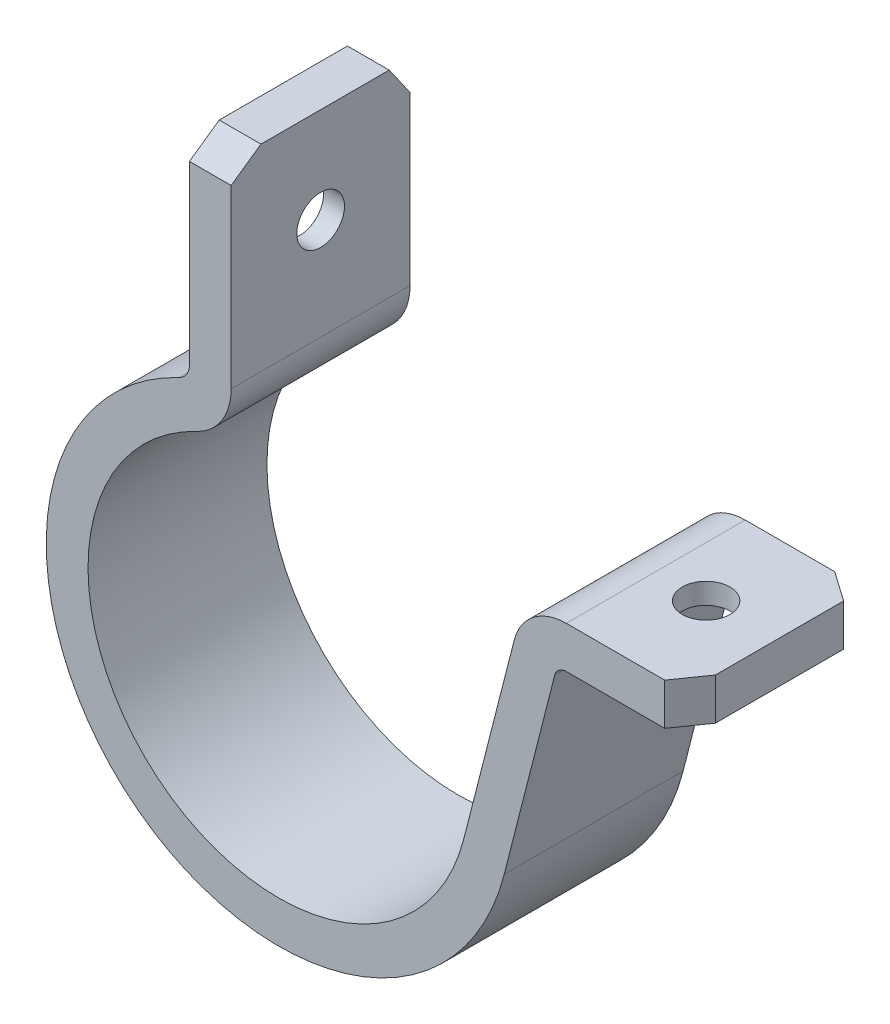
ISO-10303-21;
HEADER;
FILE_DESCRIPTION(('STEP AP214'),'2;1');
FILE_NAME('part.step','',(''),(''),'','','');
FILE_SCHEMA(('AUTOMOTIVE_DESIGN { 1 0 10303 214 1 1 1 1 }'));
ENDSEC;
DATA;
#1=APPLICATION_CONTEXT('core data for automotive mechanical design processes');
#2=APPLICATION_PROTOCOL_DEFINITION('international standard','automotive_design',2000,#1);
#3=PRODUCT_CONTEXT('',#1,'mechanical');
#4=PRODUCT('Part','Part','',(#3));
#5=PRODUCT_RELATED_PRODUCT_CATEGORY('part','',(#4));
#6=PRODUCT_DEFINITION_FORMATION('','',#4);
#7=PRODUCT_DEFINITION_CONTEXT('part definition',#1,'design');
#8=PRODUCT_DEFINITION('design','',#6,#7);
#9=PRODUCT_DEFINITION_SHAPE('','',#8);
#10=(LENGTH_UNIT() NAMED_UNIT(*) SI_UNIT(.MILLI.,.METRE.));
#11=(NAMED_UNIT(*) PLANE_ANGLE_UNIT() SI_UNIT($,.RADIAN.));
#12=(NAMED_UNIT(*) SI_UNIT($,.STERADIAN.) SOLID_ANGLE_UNIT());
#13=UNCERTAINTY_MEASURE_WITH_UNIT(LENGTH_MEASURE(1.E-05),#10,'distance_accuracy_value','');
#14=(GEOMETRIC_REPRESENTATION_CONTEXT(3) GLOBAL_UNCERTAINTY_ASSIGNED_CONTEXT((#13)) GLOBAL_UNIT_ASSIGNED_CONTEXT((#10,
#11,#12)) REPRESENTATION_CONTEXT('',''));
#15=CARTESIAN_POINT('',(0.,0.,0.));
#16=DIRECTION('',(0.,0.,1.));
#17=DIRECTION('',(1.,0.,0.));
#18=AXIS2_PLACEMENT_3D('',#15,#16,#17);
#19=CARTESIAN_POINT('',(38.1,-3.5,15.));
#20=DIRECTION('',(-1.,0.,0.));
#21=DIRECTION('',(0.,0.,1.));
#22=AXIS2_PLACEMENT_3D('',#19,#20,#21);
#23=PLANE('',#22);
#24=DIRECTION('',(0.,0.,-1.));
#25=VECTOR('',#24,1.);
#26=CARTESIAN_POINT('',(38.1,-3.5,15.));
#27=LINE('',#26,#25);
#28=CARTESIAN_POINT('',(38.1,-3.5,12.5));
#29=VERTEX_POINT('',#28);
#30=CARTESIAN_POINT('',(38.1,-3.5,1.75051884552427));
#31=VERTEX_POINT('',#30);
#32=EDGE_CURVE('E212',#29,#31,#27,.T.);
#33=ORIENTED_EDGE('',*,*,#32,.T.);
#34=DIRECTION('',(0.,1.,0.));
#35=VECTOR('',#34,1.);
#36=CARTESIAN_POINT('',(38.1,-3.5,1.75051884552427));
#37=LINE('',#36,#35);
#38=CARTESIAN_POINT('',(38.1,0.,1.75051884552427));
#39=VERTEX_POINT('',#38);
#40=EDGE_CURVE('E258',#31,#39,#37,.T.);
#41=ORIENTED_EDGE('',*,*,#40,.T.);
#42=DIRECTION('',(0.,0.,-1.));
#43=VECTOR('',#42,1.);
#44=CARTESIAN_POINT('',(38.1,0.,15.));
#45=LINE('',#44,#43);
#46=CARTESIAN_POINT('',(38.1,0.,12.5));
#47=VERTEX_POINT('',#46);
#48=EDGE_CURVE('E191',#47,#39,#45,.T.);
#49=ORIENTED_EDGE('',*,*,#48,.F.);
#50=DIRECTION('',(0.,-1.,0.));
#51=VECTOR('',#50,1.);
#52=CARTESIAN_POINT('',(38.1,-3.5,12.5));
#53=LINE('',#52,#51);
#54=EDGE_CURVE('E256',#47,#29,#53,.T.);
#55=ORIENTED_EDGE('',*,*,#54,.T.);
#56=EDGE_LOOP('',(#33,#41,#49,#55));
#57=FACE_BOUND('',#56,.T.);
#58=ADVANCED_FACE('F35',(#57),#23,.F.);
#59=CARTESIAN_POINT('',(24.6,0.,15.));
#60=DIRECTION('',(0.,-1.,0.));
#61=DIRECTION('',(0.,0.,-1.));
#62=AXIS2_PLACEMENT_3D('',#59,#60,#61);
#63=PLANE('',#62);
#64=CARTESIAN_POINT('',(32.3184466019417,0.,7.5));
#65=DIRECTION('',(0.,-1.,0.));
#66=DIRECTION('',(0.,0.,-1.));
#67=AXIS2_PLACEMENT_3D('',#64,#65,#66);
#68=CIRCLE('',#67,2.);
#69=CARTESIAN_POINT('',(32.3184466019417,0.,5.5));
#70=VERTEX_POINT('',#69);
#71=EDGE_CURVE('E215',#70,#70,#68,.T.);
#72=ORIENTED_EDGE('',*,*,#71,.T.);
#73=EDGE_LOOP('',(#72));
#74=FACE_BOUND('',#73,.T.);
#75=DIRECTION('',(-1.,0.,0.));
#76=VECTOR('',#75,1.);
#77=CARTESIAN_POINT('',(24.6,0.,0.));
#78=LINE('',#77,#76);
#79=CARTESIAN_POINT('',(35.6,0.,0.));
#80=VERTEX_POINT('',#79);
#81=CARTESIAN_POINT('',(28.095145631068,0.,0.));
#82=VERTEX_POINT('',#81);
#83=EDGE_CURVE('E213',#80,#82,#78,.T.);
#84=ORIENTED_EDGE('',*,*,#83,.T.);
#85=DIRECTION('',(0.,0.,-1.));
#86=VECTOR('',#85,1.);
#87=CARTESIAN_POINT('',(28.095145631068,0.,15.));
#88=LINE('',#87,#86);
#89=CARTESIAN_POINT('',(28.095145631068,0.,15.));
#90=VERTEX_POINT('',#89);
#91=EDGE_CURVE('E43',#82,#90,#88,.F.);
#92=ORIENTED_EDGE('',*,*,#91,.T.);
#93=DIRECTION('',(-1.,0.,0.));
#94=VECTOR('',#93,1.);
#95=CARTESIAN_POINT('',(24.6,0.,15.));
#96=LINE('',#95,#94);
#97=CARTESIAN_POINT('',(36.3494811544757,0.,15.));
#98=VERTEX_POINT('',#97);
#99=EDGE_CURVE('E182',#98,#90,#96,.T.);
#100=ORIENTED_EDGE('',*,*,#99,.F.);
#101=DIRECTION('',(0.573576436351043,0.,-0.819152044288994));
#102=VECTOR('',#101,1.);
#103=CARTESIAN_POINT('',(36.3494811544757,0.,15.));
#104=LINE('',#103,#102);
#105=EDGE_CURVE('E261',#98,#47,#104,.T.);
#106=ORIENTED_EDGE('',*,*,#105,.T.);
#107=ORIENTED_EDGE('',*,*,#48,.T.);
#108=DIRECTION('',(0.819152044288992,0.,0.573576436351045));
#109=VECTOR('',#108,1.);
#110=CARTESIAN_POINT('',(38.1,0.,1.75051884552427));
#111=LINE('',#110,#109);
#112=EDGE_CURVE('E263',#39,#80,#111,.F.);
#113=ORIENTED_EDGE('',*,*,#112,.T.);
#114=EDGE_LOOP('',(#84,#92,#100,#106,#107,#113));
#115=FACE_BOUND('',#114,.T.);
#116=ADVANCED_FACE('F374',(#74,#115),#63,.F.);
#117=CARTESIAN_POINT('',(24.6,0.,15.));
#118=DIRECTION('',(0.968898818272679,-0.247457228526074,0.));
#119=DIRECTION('',(0.247457228526074,0.968898818272679,0.));
#120=AXIS2_PLACEMENT_3D('',#117,#118,#119);
#121=PLANE('',#120);
#122=DIRECTION('',(-0.247457228526074,-0.968898818272679,0.));
#123=VECTOR('',#122,1.);
#124=CARTESIAN_POINT('',(24.6,0.,15.));
#125=LINE('',#124,#123);
#126=CARTESIAN_POINT('',(23.7351009488409,-3.38644247163267,15.));
#127=VERTEX_POINT('',#126);
#128=CARTESIAN_POINT('',(19.5023810923629,-19.9593156564172,15.));
#129=VERTEX_POINT('',#128);
#130=EDGE_CURVE('E172',#127,#129,#125,.T.);
#131=ORIENTED_EDGE('',*,*,#130,.F.);
#132=DIRECTION('',(0.,0.,-1.));
#133=VECTOR('',#132,1.);
#134=CARTESIAN_POINT('',(23.7351009488409,-3.38644247163267,15.));
#135=LINE('',#134,#133);
#136=CARTESIAN_POINT('',(23.7351009488409,-3.38644247163267,0.));
#137=VERTEX_POINT('',#136);
#138=EDGE_CURVE('E361',#127,#137,#135,.T.);
#139=ORIENTED_EDGE('',*,*,#138,.T.);
#140=DIRECTION('',(-0.247457228526074,-0.968898818272679,0.));
#141=VECTOR('',#140,1.);
#142=CARTESIAN_POINT('',(24.6,0.,0.));
#143=LINE('',#142,#141);
#144=CARTESIAN_POINT('',(19.5023810923629,-19.9593156564172,0.));
#145=VERTEX_POINT('',#144);
#146=EDGE_CURVE('E187',#137,#145,#143,.T.);
#147=ORIENTED_EDGE('',*,*,#146,.T.);
#148=DIRECTION('',(0.,0.,-1.));
#149=VECTOR('',#148,1.);
#150=CARTESIAN_POINT('',(19.5023810923629,-19.9593156564172,15.));
#151=LINE('',#150,#149);
#152=EDGE_CURVE('E185',#129,#145,#151,.T.);
#153=ORIENTED_EDGE('',*,*,#152,.F.);
#154=EDGE_LOOP('',(#131,#139,#147,#153));
#155=FACE_BOUND('',#154,.T.);
#156=ADVANCED_FACE('F186',(#155),#121,.F.);
#157=CARTESIAN_POINT('',(4.,-16.,15.));
#158=DIRECTION('',(0.,0.,-1.));
#159=DIRECTION('',(-1.,0.,0.));
#160=AXIS2_PLACEMENT_3D('',#157,#158,#159);
#161=CYLINDRICAL_SURFACE('',#160,16.);
#162=CARTESIAN_POINT('',(4.,-16.,0.));
#163=DIRECTION('',(0.,0.,-1.));
#164=DIRECTION('',(1.,0.,0.));
#165=AXIS2_PLACEMENT_3D('',#162,#163,#164);
#166=CIRCLE('',#165,16.);
#167=CARTESIAN_POINT('',(-2.85714285714286,-1.54387355351597,0.));
#168=VERTEX_POINT('',#167);
#169=EDGE_CURVE('E217',#145,#168,#166,.T.);
#170=ORIENTED_EDGE('',*,*,#169,.T.);
#171=DIRECTION('',(0.,0.,-1.));
#172=VECTOR('',#171,1.);
#173=CARTESIAN_POINT('',(-2.85714285714286,-1.54387355351597,15.));
#174=LINE('',#173,#172);
#175=CARTESIAN_POINT('',(-2.85714285714286,-1.54387355351597,15.));
#176=VERTEX_POINT('',#175);
#177=EDGE_CURVE('E196',#168,#176,#174,.F.);
#178=ORIENTED_EDGE('',*,*,#177,.T.);
#179=CARTESIAN_POINT('',(4.,-16.,15.));
#180=DIRECTION('',(0.,0.,-1.));
#181=DIRECTION('',(1.,0.,0.));
#182=AXIS2_PLACEMENT_3D('',#179,#180,#181);
#183=CIRCLE('',#182,16.);
#184=EDGE_CURVE('E176',#129,#176,#183,.T.);
#185=ORIENTED_EDGE('',*,*,#184,.F.);
#186=ORIENTED_EDGE('',*,*,#152,.T.);
#187=EDGE_LOOP('',(#170,#178,#185,#186));
#188=FACE_BOUND('',#187,.T.);
#189=ADVANCED_FACE('F194',(#188),#161,.F.);
#190=CARTESIAN_POINT('',(0.,-0.508066615170333,15.));
#191=DIRECTION('',(-1.,0.,0.));
#192=DIRECTION('',(0.,0.,1.));
#193=AXIS2_PLACEMENT_3D('',#190,#191,#192);
#194=PLANE('',#193);
#195=CARTESIAN_POINT('',(0.,11.4919333848297,7.5));
#196=DIRECTION('',(-1.,0.,0.));
#197=DIRECTION('',(0.,0.,1.));
#198=AXIS2_PLACEMENT_3D('',#195,#196,#197);
#199=CIRCLE('',#198,2.);
#200=CARTESIAN_POINT('',(0.,11.4919333848297,9.5));
#201=VERTEX_POINT('',#200);
#202=EDGE_CURVE('E450',#201,#201,#199,.F.);
#203=ORIENTED_EDGE('',*,*,#202,.F.);
#204=EDGE_LOOP('',(#203));
#205=FACE_BOUND('',#204,.T.);
#206=DIRECTION('',(0.,1.,0.));
#207=VECTOR('',#206,1.);
#208=CARTESIAN_POINT('',(0.,-0.508066615170333,15.));
#209=LINE('',#208,#207);
#210=CARTESIAN_POINT('',(0.,2.97366596101029,15.));
#211=VERTEX_POINT('',#210);
#212=CARTESIAN_POINT('',(0.,17.7414145393054,15.));
#213=VERTEX_POINT('',#212);
#214=EDGE_CURVE('E197',#211,#213,#209,.T.);
#215=ORIENTED_EDGE('',*,*,#214,.F.);
#216=DIRECTION('',(0.,0.,-1.));
#217=VECTOR('',#216,1.);
#218=CARTESIAN_POINT('',(0.,2.97366596101029,15.));
#219=LINE('',#218,#217);
#220=CARTESIAN_POINT('',(0.,2.97366596101029,0.));
#221=VERTEX_POINT('',#220);
#222=EDGE_CURVE('E296',#211,#221,#219,.T.);
#223=ORIENTED_EDGE('',*,*,#222,.T.);
#224=DIRECTION('',(0.,1.,0.));
#225=VECTOR('',#224,1.);
#226=CARTESIAN_POINT('',(0.,-0.508066615170333,0.));
#227=LINE('',#226,#225);
#228=CARTESIAN_POINT('',(0.,16.9919333848297,0.));
#229=VERTEX_POINT('',#228);
#230=EDGE_CURVE('E219',#221,#229,#227,.T.);
#231=ORIENTED_EDGE('',*,*,#230,.T.);
#232=DIRECTION('',(0.,-0.819152044288993,-0.573576436351045));
#233=VECTOR('',#232,1.);
#234=CARTESIAN_POINT('',(0.,19.4919333848297,1.75051884552427));
#235=LINE('',#234,#233);
#236=CARTESIAN_POINT('',(0.,19.4919333848297,1.75051884552427));
#237=VERTEX_POINT('',#236);
#238=EDGE_CURVE('E294',#229,#237,#235,.F.);
#239=ORIENTED_EDGE('',*,*,#238,.T.);
#240=DIRECTION('',(0.,0.,-1.));
#241=VECTOR('',#240,1.);
#242=CARTESIAN_POINT('',(0.,19.4919333848297,15.));
#243=LINE('',#242,#241);
#244=CARTESIAN_POINT('',(0.,19.4919333848297,12.5));
#245=VERTEX_POINT('',#244);
#246=EDGE_CURVE('E192',#245,#237,#243,.T.);
#247=ORIENTED_EDGE('',*,*,#246,.F.);
#248=DIRECTION('',(0.,-0.573576436351045,0.819152044288992));
#249=VECTOR('',#248,1.);
#250=CARTESIAN_POINT('',(0.,17.7414145393054,15.));
#251=LINE('',#250,#249);
#252=EDGE_CURVE('E291',#245,#213,#251,.T.);
#253=ORIENTED_EDGE('',*,*,#252,.T.);
#254=EDGE_LOOP('',(#215,#223,#231,#239,#247,#253));
#255=FACE_BOUND('',#254,.T.);
#256=ADVANCED_FACE('F415',(#205,#255),#194,.F.);
#257=CARTESIAN_POINT('',(0.,19.4919333848297,15.));
#258=DIRECTION('',(0.,-1.,0.));
#259=DIRECTION('',(0.,0.,-1.));
#260=AXIS2_PLACEMENT_3D('',#257,#258,#259);
#261=PLANE('',#260);
#262=ORIENTED_EDGE('',*,*,#246,.T.);
#263=DIRECTION('',(-1.,0.,0.));
#264=VECTOR('',#263,1.);
#265=CARTESIAN_POINT('',(0.,19.4919333848297,1.75051884552427));
#266=LINE('',#265,#264);
#267=CARTESIAN_POINT('',(-3.5,19.4919333848297,1.75051884552427));
#268=VERTEX_POINT('',#267);
#269=EDGE_CURVE('E284',#237,#268,#266,.T.);
#270=ORIENTED_EDGE('',*,*,#269,.T.);
#271=DIRECTION('',(0.,0.,-1.));
#272=VECTOR('',#271,1.);
#273=CARTESIAN_POINT('',(-3.5,19.4919333848297,15.));
#274=LINE('',#273,#272);
#275=CARTESIAN_POINT('',(-3.5,19.4919333848297,12.5));
#276=VERTEX_POINT('',#275);
#277=EDGE_CURVE('E236',#276,#268,#274,.T.);
#278=ORIENTED_EDGE('',*,*,#277,.F.);
#279=DIRECTION('',(1.,0.,0.));
#280=VECTOR('',#279,1.);
#281=CARTESIAN_POINT('',(0.,19.4919333848297,12.5));
#282=LINE('',#281,#280);
#283=EDGE_CURVE('E282',#276,#245,#282,.T.);
#284=ORIENTED_EDGE('',*,*,#283,.T.);
#285=EDGE_LOOP('',(#262,#270,#278,#284));
#286=FACE_BOUND('',#285,.T.);
#287=ADVANCED_FACE('F466',(#286),#261,.F.);
#288=CARTESIAN_POINT('',(-3.5,2.00000000000001,15.));
#289=DIRECTION('',(1.,0.,0.));
#290=DIRECTION('',(0.,1.,0.));
#291=AXIS2_PLACEMENT_3D('',#288,#289,#290);
#292=PLANE('',#291);
#293=CARTESIAN_POINT('',(-3.5,11.4919333848297,7.5));
#294=DIRECTION('',(1.,0.,0.));
#295=DIRECTION('',(0.,1.,0.));
#296=AXIS2_PLACEMENT_3D('',#293,#294,#295);
#297=CIRCLE('',#296,4.50000000000002);
#298=CARTESIAN_POINT('',(-3.5,15.9919333848297,7.5));
#299=VERTEX_POINT('',#298);
#300=EDGE_CURVE('E253',#299,#299,#297,.T.);
#301=ORIENTED_EDGE('',*,*,#300,.T.);
#302=EDGE_LOOP('',(#301));
#303=FACE_BOUND('',#302,.T.);
#304=DIRECTION('',(0.,-1.,0.));
#305=VECTOR('',#304,1.);
#306=CARTESIAN_POINT('',(-3.5,2.00000000000001,0.));
#307=LINE('',#306,#305);
#308=CARTESIAN_POINT('',(-3.5,16.9919333848297,0.));
#309=VERTEX_POINT('',#308);
#310=CARTESIAN_POINT('',(-3.5,2.97366596101029,0.));
#311=VERTEX_POINT('',#310);
#312=EDGE_CURVE('E221',#309,#311,#307,.T.);
#313=ORIENTED_EDGE('',*,*,#312,.T.);
#314=DIRECTION('',(0.,0.,1.));
#315=VECTOR('',#314,1.);
#316=CARTESIAN_POINT('',(-3.5,2.97366596101029,15.));
#317=LINE('',#316,#315);
#318=CARTESIAN_POINT('',(-3.5,2.97366596101029,15.));
#319=VERTEX_POINT('',#318);
#320=EDGE_CURVE('E307',#311,#319,#317,.T.);
#321=ORIENTED_EDGE('',*,*,#320,.T.);
#322=DIRECTION('',(0.,-1.,0.));
#323=VECTOR('',#322,1.);
#324=CARTESIAN_POINT('',(-3.5,2.00000000000001,15.));
#325=LINE('',#324,#323);
#326=CARTESIAN_POINT('',(-3.5,17.7414145393054,15.));
#327=VERTEX_POINT('',#326);
#328=EDGE_CURVE('E199',#327,#319,#325,.T.);
#329=ORIENTED_EDGE('',*,*,#328,.F.);
#330=DIRECTION('',(0.,0.573576436351045,-0.819152044288992));
#331=VECTOR('',#330,1.);
#332=CARTESIAN_POINT('',(-3.5,17.7414145393054,15.));
#333=LINE('',#332,#331);
#334=EDGE_CURVE('E287',#327,#276,#333,.T.);
#335=ORIENTED_EDGE('',*,*,#334,.T.);
#336=ORIENTED_EDGE('',*,*,#277,.T.);
#337=DIRECTION('',(0.,0.819152044288993,0.573576436351045));
#338=VECTOR('',#337,1.);
#339=CARTESIAN_POINT('',(-3.5,19.4919333848297,1.75051884552427));
#340=LINE('',#339,#338);
#341=EDGE_CURVE('E289',#268,#309,#340,.F.);
#342=ORIENTED_EDGE('',*,*,#341,.T.);
#343=EDGE_LOOP('',(#313,#321,#329,#335,#336,#342));
#344=FACE_BOUND('',#343,.T.);
#345=ADVANCED_FACE('F424',(#303,#344),#292,.F.);
#346=CARTESIAN_POINT('',(4.,-16.,15.));
#347=DIRECTION('',(0.,0.,-1.));
#348=DIRECTION('',(-1.,0.,0.));
#349=AXIS2_PLACEMENT_3D('',#346,#347,#348);
#350=CYLINDRICAL_SURFACE('',#349,19.5);
#351=CARTESIAN_POINT('',(4.,-16.,15.));
#352=DIRECTION('',(0.,0.,1.));
#353=DIRECTION('',(1.,0.,0.));
#354=AXIS2_PLACEMENT_3D('',#351,#352,#353);
#355=CIRCLE('',#354,19.5);
#356=CARTESIAN_POINT('',(-4.35714285714286,1.61840410665241,15.));
#357=VERTEX_POINT('',#356);
#358=CARTESIAN_POINT('',(22.8935269563172,-20.8254159562585,15.));
#359=VERTEX_POINT('',#358);
#360=EDGE_CURVE('E205',#357,#359,#355,.T.);
#361=ORIENTED_EDGE('',*,*,#360,.F.);
#362=DIRECTION('',(0.,0.,-1.));
#363=VECTOR('',#362,1.);
#364=CARTESIAN_POINT('',(-4.35714285714286,1.61840410665241,15.));
#365=LINE('',#364,#363);
#366=CARTESIAN_POINT('',(-4.35714285714286,1.61840410665241,0.));
#367=VERTEX_POINT('',#366);
#368=EDGE_CURVE('E304',#357,#367,#365,.T.);
#369=ORIENTED_EDGE('',*,*,#368,.T.);
#370=CARTESIAN_POINT('',(4.,-16.,0.));
#371=DIRECTION('',(0.,0.,1.));
#372=DIRECTION('',(1.,0.,0.));
#373=AXIS2_PLACEMENT_3D('',#370,#371,#372);
#374=CIRCLE('',#373,19.5);
#375=CARTESIAN_POINT('',(22.8935269563172,-20.8254159562585,0.));
#376=VERTEX_POINT('',#375);
#377=EDGE_CURVE('E224',#367,#376,#374,.T.);
#378=ORIENTED_EDGE('',*,*,#377,.T.);
#379=DIRECTION('',(0.,0.,-1.));
#380=VECTOR('',#379,1.);
#381=CARTESIAN_POINT('',(22.8935269563172,-20.8254159562585,15.));
#382=LINE('',#381,#380);
#383=EDGE_CURVE('E233',#359,#376,#382,.T.);
#384=ORIENTED_EDGE('',*,*,#383,.F.);
#385=EDGE_LOOP('',(#361,#369,#378,#384));
#386=FACE_BOUND('',#385,.T.);
#387=ADVANCED_FACE('F432',(#386),#350,.T.);
#388=CARTESIAN_POINT('',(27.3184466019418,-3.5,15.));
#389=DIRECTION('',(-0.968898818272679,0.247457228526074,0.));
#390=DIRECTION('',(-0.247457228526074,-0.968898818272679,0.));
#391=AXIS2_PLACEMENT_3D('',#388,#389,#390);
#392=PLANE('',#391);
#393=DIRECTION('',(0.247457228526074,0.968898818272679,0.));
#394=VECTOR('',#393,1.);
#395=CARTESIAN_POINT('',(27.3184466019418,-3.5,0.));
#396=LINE('',#395,#394);
#397=CARTESIAN_POINT('',(27.1262468127953,-4.25254277147393,0.));
#398=VERTEX_POINT('',#397);
#399=EDGE_CURVE('E226',#376,#398,#396,.T.);
#400=ORIENTED_EDGE('',*,*,#399,.T.);
#401=DIRECTION('',(0.,0.,-1.));
#402=VECTOR('',#401,1.);
#403=CARTESIAN_POINT('',(27.1262468127953,-4.25254277147393,15.));
#404=LINE('',#403,#402);
#405=CARTESIAN_POINT('',(27.1262468127953,-4.25254277147393,5.94638199372662));
#406=VERTEX_POINT('',#405);
#407=EDGE_CURVE('E328',#398,#406,#404,.F.);
#408=ORIENTED_EDGE('',*,*,#407,.T.);
#409=CARTESIAN_POINT('',(28.4175514871394,-3.5,9.74343872287866));
#410=CARTESIAN_POINT('',(27.4026261468368,-3.17040178192676,9.73122168616638));
#411=CARTESIAN_POINT('',(27.1426846941343,-4.1881815729787,9.91940358174777));
#412=CARTESIAN_POINT('',(28.3760583258911,-3.5,9.67130535905264));
#413=CARTESIAN_POINT('',(27.3892732654113,-3.22268391209828,9.67043270403966));
#414=CARTESIAN_POINT('',(27.138213792177,-4.2056870289672,9.81836867931254));
#415=CARTESIAN_POINT('',(28.3353191814921,-3.5,9.59582253617781));
#416=CARTESIAN_POINT('',(27.3770104517222,-3.27069796997345,9.5999439384864));
#417=CARTESIAN_POINT('',(27.1348505468264,-4.21885554485637,9.71668513288474));
#418=CARTESIAN_POINT('',(28.2564531121207,-3.5,9.43853362975475));
#419=CARTESIAN_POINT('',(27.3552463228236,-3.35591366117057,9.44700404413951));
#420=CARTESIAN_POINT('',(27.1298957522554,-4.23825564334316,9.51285583983287));
#421=CARTESIAN_POINT('',(28.2183197865827,-3.5,9.35674417338013));
#422=CARTESIAN_POINT('',(27.3455987675135,-3.39368788581062,9.36469919315113));
#423=CARTESIAN_POINT('',(27.1282997039324,-4.2445048418137,9.41071193477599));
#424=CARTESIAN_POINT('',(28.1456612580095,-3.5,9.18711311490691));
#425=CARTESIAN_POINT('',(27.3288079108714,-3.45943113063437,9.19208086825628));
#426=CARTESIAN_POINT('',(27.1264204046041,-4.25186308674851,9.2065948908849));
#427=CARTESIAN_POINT('',(28.1111251537476,-3.5,9.09929122106011));
#428=CARTESIAN_POINT('',(27.3215505240521,-3.48784684334094,9.10168608589496));
#429=CARTESIAN_POINT('',(27.1261330673742,-4.25298813249558,9.10462221566104));
#430=CARTESIAN_POINT('',(28.0464851921491,-3.5,8.9176214762413));
#431=CARTESIAN_POINT('',(27.3091112994848,-3.53655162378015,8.91510992501698));
#432=CARTESIAN_POINT('',(27.1264377549234,-4.25179515297283,8.90063520735166));
#433=CARTESIAN_POINT('',(28.0163847237309,-3.5,8.82376909565972));
#434=CARTESIAN_POINT('',(27.3038540937139,-3.55713578892725,8.81866529581061));
#435=CARTESIAN_POINT('',(27.1270304482744,-4.24947450996373,8.79862090151727));
#436=CARTESIAN_POINT('',(27.9508656929804,-3.5,8.59259921905107));
#437=CARTESIAN_POINT('',(27.2933676163752,-3.59819474510246,8.58396104338625));
#438=CARTESIAN_POINT('',(27.1290000168616,-4.24176282302694,8.55454708781291));
#439=CARTESIAN_POINT('',(27.9180136704116,-3.5,8.45270784279229));
#440=CARTESIAN_POINT('',(27.2887871860286,-3.61612905066502,8.44208978891873));
#441=CARTESIAN_POINT('',(27.130593665765,-4.23552301929048,8.4125223813621));
#442=CARTESIAN_POINT('',(27.8654193616251,-3.5,8.16477261041706));
#443=CARTESIAN_POINT('',(27.2820676990581,-3.64243865990063,8.15439539333096));
#444=CARTESIAN_POINT('',(27.1335927137894,-4.22378048865558,8.12849101701479));
#445=CARTESIAN_POINT('',(27.8456719810805,-3.5,8.01673194653795));
#446=CARTESIAN_POINT('',(27.2798548478556,-3.65110290029442,8.00733808934886));
#447=CARTESIAN_POINT('',(27.1349981858929,-4.21827747600025,7.98648437358597));
#448=CARTESIAN_POINT('',(27.8211227191939,-3.5,7.71629792293799));
#449=CARTESIAN_POINT('',(27.2771914778189,-3.66153111084442,7.71205493204015));
#450=CARTESIAN_POINT('',(27.1367979943708,-4.21123047107859,7.70218834506808));
#451=CARTESIAN_POINT('',(27.8163370711707,-3.5,7.56390001637801));
#452=CARTESIAN_POINT('',(27.2767160402169,-3.66339264842598,7.56240483148061));
#453=CARTESIAN_POINT('',(27.1371912324004,-4.20969077929238,7.55989882036828));
#454=CARTESIAN_POINT('',(27.822276750721,-3.5,7.26012224368699));
#455=CARTESIAN_POINT('',(27.2773328291844,-3.66097766097421,7.26514375973833));
#456=CARTESIAN_POINT('',(27.1367315614457,-4.21149058383803,7.27533158110358));
#457=CARTESIAN_POINT('',(27.8330052461924,-3.5,7.10874259181932));
#458=CARTESIAN_POINT('',(27.2784314327549,-3.6566761673081,7.11606039062521));
#459=CARTESIAN_POINT('',(27.1358783979531,-4.21483107667667,7.13305387488508));
#460=CARTESIAN_POINT('',(27.8626337421966,-3.5,6.86334665595978));
#461=CARTESIAN_POINT('',(27.2818105015387,-3.64344569604245,6.87409859526299));
#462=CARTESIAN_POINT('',(27.1338540674645,-4.22275717942148,6.89791917109363));
#463=CARTESIAN_POINT('',(27.8774123130629,-3.5,6.76763478480616));
#464=CARTESIAN_POINT('',(27.2835681086108,-3.63656392732102,6.77884939954667));
#465=CARTESIAN_POINT('',(27.1328956330346,-4.22650985212381,6.80502611827032));
#466=CARTESIAN_POINT('',(27.9125114561519,-3.5,6.57975158054467));
#467=CARTESIAN_POINT('',(27.2880862080893,-3.61887367324489,6.59097981483114));
#468=CARTESIAN_POINT('',(27.1309231778608,-4.23423284125766,6.61926442760687));
#469=CARTESIAN_POINT('',(27.9328311437997,-3.5,6.48757968499783));
#470=CARTESIAN_POINT('',(27.2908675250673,-3.60798365096001,6.49801596034627));
#471=CARTESIAN_POINT('',(27.1299091660098,-4.23820312286967,6.52639578823601));
#472=CARTESIAN_POINT('',(27.978280278185,-3.5,6.30771346140147));
#473=CARTESIAN_POINT('',(27.2976483331034,-3.5814339440381,6.31573691094919));
#474=CARTESIAN_POINT('',(27.1281207928843,-4.24520535359142,6.34083540655484));
#475=CARTESIAN_POINT('',(28.0033982711202,-3.5,6.22000908822535));
#476=CARTESIAN_POINT('',(27.3016778220157,-3.56565680522234,6.22611624695608));
#477=CARTESIAN_POINT('',(27.1273458721802,-4.24823949310307,6.24814376345471));
#478=CARTESIAN_POINT('',(28.0577401173212,-3.5,6.04934458807884));
#479=CARTESIAN_POINT('',(27.3111978078563,-3.5283820685501,6.05130335536115));
#480=CARTESIAN_POINT('',(27.1263440178869,-4.25216217277849,6.06271499341099));
#481=CARTESIAN_POINT('',(28.0869635301939,-3.5,5.96638395358349));
#482=CARTESIAN_POINT('',(27.3167358571155,-3.50669828337784,5.96587604693991));
#483=CARTESIAN_POINT('',(27.1261170255682,-4.25305094289279,5.96997787240777));
#484=CARTESIAN_POINT('',(28.1558595718721,-3.5,5.78708312658845));
#485=CARTESIAN_POINT('',(27.3310241097417,-3.45075378271718,5.78136746084818));
#486=CARTESIAN_POINT('',(27.1265739593767,-4.25126185542234,5.76326539998702));
#487=CARTESIAN_POINT('',(28.1963923992178,-3.5,5.69203095330424));
#488=CARTESIAN_POINT('',(27.3402830928389,-3.41450098123419,5.68401151108533));
#489=CARTESIAN_POINT('',(27.1274784472144,-4.24772040625,5.64929092839895));
#490=CARTESIAN_POINT('',(28.2810990851894,-3.5,5.51005335685545));
#491=CARTESIAN_POINT('',(27.3617341939221,-3.33051092519932,5.50191696823067));
#492=CARTESIAN_POINT('',(27.1311876687909,-4.23319724835494,5.4219848161612));
#493=CARTESIAN_POINT('',(28.3252670886585,-3.5,5.42311532834394));
#494=CARTESIAN_POINT('',(27.3740944021061,-3.28211552703545,5.41713204118827));
#495=CARTESIAN_POINT('',(27.1339893973068,-4.22222730633964,5.30865244427893));
#496=CARTESIAN_POINT('',(28.4168203941087,-3.5,5.25576842602417));
#497=CARTESIAN_POINT('',(27.4022688616709,-3.17180070317509,5.26414736717762));
#498=CARTESIAN_POINT('',(27.1421957341529,-4.19009605634611,5.08118042046108));
#499=CARTESIAN_POINT('',(28.4642512494094,-3.5,5.17551737194117));
#500=CARTESIAN_POINT('',(27.4183709542014,-3.10875425867434,5.19681484615534));
#501=CARTESIAN_POINT('',(27.1476493888665,-4.16874271120936,4.96706719542123));
#502=CARTESIAN_POINT('',(28.5361762590862,-3.5,5.0614612695501));
#503=CARTESIAN_POINT('',(27.44444867009,-3.00664906555395,5.1179859344001));
#504=CARTESIAN_POINT('',(27.1583515161838,-4.12683939493717,4.79814072550364));
#505=CARTESIAN_POINT('',(28.5603563031852,-3.5,5.02439226433836));
#506=CARTESIAN_POINT('',(27.4537221918393,-2.97033933915128,5.09507237465382));
#507=CARTESIAN_POINT('',(27.1623553359715,-4.11116276150864,4.74203747091073));
#508=CARTESIAN_POINT('',(28.6087480820765,-3.5,4.95244835483392));
#509=CARTESIAN_POINT('',(27.4728937907444,-2.89527449002922,5.05824521173497));
#510=CARTESIAN_POINT('',(27.1713132247144,-4.07608887068348,4.63101268557682));
#511=CARTESIAN_POINT('',(28.6329598188365,-3.5,4.91757624026692));
#512=CARTESIAN_POINT('',(27.4828251318578,-2.85638912496631,5.04460022363359));
#513=CARTESIAN_POINT('',(27.1762684707756,-4.05668700442348,4.57609271339727));
#514=CARTESIAN_POINT('',(28.6570662995592,-3.5,4.88383978294039));
#515=CARTESIAN_POINT('',(27.492793605028,-2.81735837233024,5.03670338401033));
#516=CARTESIAN_POINT('',(27.1817479853126,-4.03523240723425,4.5219886696753));
#517=(BOUNDED_SURFACE() B_SPLINE_SURFACE(3,2,((#409,#410,#411),(#412,#413,#414),(#415,#416,
#417),(#418,#419,#420),(#421,#422,#423),(#424,#425,#426),(#427,#428,#429),(#430,#431,#432),
(#433,#434,#435),(#436,#437,#438),(#439,#440,#441),(#442,#443,#444),(#445,#446,#447),(#448,#449,
#450),(#451,#452,#453),(#454,#455,#456),(#457,#458,#459),(#460,#461,#462),(#463,#464,#465),
(#466,#467,#468),(#469,#470,#471),(#472,#473,#474),(#475,#476,#477),(#478,#479,#480),(#481,#482,
#483),(#484,#485,#486),(#487,#488,#489),(#490,#491,#492),(#493,#494,#495),(#496,#497,#498),
(#499,#500,#501),(#502,#503,#504),(#505,#506,#507),(#508,#509,#510),(#511,#512,#513),(#514,#515,
#516)),.UNSPECIFIED.,.F.,.F.,.F.) B_SPLINE_SURFACE_WITH_KNOTS((4,2,2,2,2,2,2,2,2,2,2,2,2,2,2,2,
2,4),(3,3),(0.,0.307600586834397,0.614416240473059,0.920273255479081,1.22636275337976,
1.65287156408724,2.07921447555885,2.50601980425371,2.93291229642378,3.21183413856716,
3.49071148011561,3.76893126246586,4.04712122261959,4.38903249483587,4.7304034437044,
5.07834293236637,5.25338808321735,5.4286512121475),(0.,1.),
.UNSPECIFIED.) GEOMETRIC_REPRESENTATION_ITEM() RATIONAL_B_SPLINE_SURFACE(((1.,0.683768446030626,
1.),(1.,0.698465173462209,1.),(1.,0.712425124020637,1.),(1.,0.73875369225855,1.),(1.,
0.751126279788707,1.),(1.,0.774202089617889,1.),(1.,0.784910407025505,1.),(1.,0.804611205964315,
1.),(1.,0.813602377096372,1.),(1.,0.832917897224575,1.),(1.,0.842375143258969,1.),(1.,
0.857365694353427,1.),(1.,0.862900524278906,1.),(1.,0.869764953560825,1.),(1.,0.871089985356856,
1.),(1.,0.869436968483488,1.),(1.,0.866458040970716,1.),(1.,0.858125020811044,1.),(1.,
0.853952124628536,1.),(1.,0.843937756130621,1.),(1.,0.83809655013447,1.),(1.,0.8248560875231,
1.),(1.,0.81746053707842,1.),(1.,0.801196475310824,1.),(1.,0.792328121958594,1.),(1.,
0.771008452058017,1.),(1.,0.75820172949434,1.),(1.,0.730638927330739,1.),(1.,0.715885960288196,
1.),(1.,0.684213975942739,1.),(1.,0.667258742415958,1.),(1.,0.640431250680093,1.),(1.,
0.63122596212848,1.),(1.,0.612375090918738,1.),(1.,0.602728974251128,1.),(1.,0.592879817864451,1.))) REPRESENTATION_ITEM('') SURFACE());
#518=CARTESIAN_POINT('',(27.1817479853126,-4.03523240723425,4.5219886696753));
#519=CARTESIAN_POINT('',(27.1762684707756,-4.05668700442348,4.57609271339727));
#520=CARTESIAN_POINT('',(27.1713132247144,-4.07608887068348,4.63101268557682));
#521=CARTESIAN_POINT('',(27.1623553359715,-4.11116276150864,4.74203747091073));
#522=CARTESIAN_POINT('',(27.1583515161838,-4.12683939493717,4.79814072550364));
#523=CARTESIAN_POINT('',(27.1476493888665,-4.16874271120936,4.96706719542124));
#524=CARTESIAN_POINT('',(27.1421957341529,-4.19009605634611,5.08118042046108));
#525=CARTESIAN_POINT('',(27.1339893973068,-4.22222730633964,5.30865244427893));
#526=CARTESIAN_POINT('',(27.1311876687909,-4.23319724835494,5.4219848161612));
#527=CARTESIAN_POINT('',(27.1274784472144,-4.24772040625,5.64929092839895));
#528=CARTESIAN_POINT('',(27.1265739593767,-4.25126185542234,5.76326539998702));
#529=CARTESIAN_POINT('',(27.1261170255682,-4.25305094289279,5.96997787240777));
#530=CARTESIAN_POINT('',(27.1263440178869,-4.25216217277849,6.06271499341099));
#531=CARTESIAN_POINT('',(27.1273458721802,-4.24823949310307,6.24814376345471));
#532=CARTESIAN_POINT('',(27.1281207928843,-4.24520535359142,6.34083540655484));
#533=CARTESIAN_POINT('',(27.1299091660098,-4.23820312286967,6.52639578823601));
#534=CARTESIAN_POINT('',(27.1309231778608,-4.23423284125766,6.61926442760687));
#535=CARTESIAN_POINT('',(27.1328956330346,-4.22650985212381,6.80502611827032));
#536=CARTESIAN_POINT('',(27.1338540674645,-4.22275717942148,6.89791917109363));
#537=CARTESIAN_POINT('',(27.1358783979531,-4.21483107667667,7.13305387488508));
#538=CARTESIAN_POINT('',(27.1367315614457,-4.21149058383803,7.27533158110358));
#539=CARTESIAN_POINT('',(27.1371912324004,-4.20969077929238,7.55989882036828));
#540=CARTESIAN_POINT('',(27.1367979943708,-4.21123047107859,7.70218834506808));
#541=CARTESIAN_POINT('',(27.1349981858929,-4.21827747600025,7.98648437358597));
#542=CARTESIAN_POINT('',(27.1335927137894,-4.22378048865558,8.12849101701479));
#543=CARTESIAN_POINT('',(27.130593665765,-4.23552301929048,8.4125223813621));
#544=CARTESIAN_POINT('',(27.1290000168616,-4.24176282302694,8.55454708781291));
#545=CARTESIAN_POINT('',(27.1270304482744,-4.24947450996373,8.79862090151727));
#546=CARTESIAN_POINT('',(27.1264377549234,-4.25179515297283,8.90063520735166));
#547=CARTESIAN_POINT('',(27.1261330673742,-4.25298813249558,9.10462221566104));
#548=CARTESIAN_POINT('',(27.1264204046041,-4.25186308674851,9.2065948908849));
#549=CARTESIAN_POINT('',(27.1282997039324,-4.2445048418137,9.41071193477599));
#550=CARTESIAN_POINT('',(27.1298957522554,-4.23825564334316,9.51285583983287));
#551=CARTESIAN_POINT('',(27.1348505468264,-4.21885554485637,9.71668513288474));
#552=CARTESIAN_POINT('',(27.138213792177,-4.2056870289672,9.81836867931254));
#553=CARTESIAN_POINT('',(27.1426846941343,-4.1881815729787,9.91940358174777));
#554=B_SPLINE_CURVE_WITH_KNOTS('',3,(#518,#519,#520,#521,#522,#523,#524,#525,#526,#527,#528,
#529,#530,#531,#532,#533,#534,#535,#536,#537,#538,#539,#540,#541,#542,#543,#544,#545,#546,#547,
#548,#549,#550,#551,#552,#553),.UNSPECIFIED.,.F.,.F.,(4,2,2,2,2,2,2,2,2,2,2,2,2,2,2,2,2,4),(0.,
0.175263128930154,0.350308279781133,0.6982477684431,1.03961871731163,1.38152998952791,
1.65971994968164,1.93793973203189,2.21681707358033,2.49573891572372,2.92263140789379,
3.34943673658865,3.77577964806026,4.20228845876774,4.50837795666842,4.81423497167444,
5.1210506253131,5.4286512121475),.UNSPECIFIED.);
#555=CARTESIAN_POINT('',(27.1262468127953,-4.25254277147393,9.05361800627337));
#556=VERTEX_POINT('',#555);
#557=EDGE_CURVE('E320',#406,#556,#554,.T.);
#558=ORIENTED_EDGE('',*,*,#557,.T.);
#559=DIRECTION('',(0.,0.,-1.));
#560=VECTOR('',#559,1.);
#561=CARTESIAN_POINT('',(27.1262468127953,-4.25254277147393,15.));
#562=LINE('',#561,#560);
#563=CARTESIAN_POINT('',(27.1262468127953,-4.25254277147393,15.));
#564=VERTEX_POINT('',#563);
#565=EDGE_CURVE('E318',#556,#564,#562,.F.);
#566=ORIENTED_EDGE('',*,*,#565,.T.);
#567=DIRECTION('',(0.247457228526074,0.968898818272679,0.));
#568=VECTOR('',#567,1.);
#569=CARTESIAN_POINT('',(27.3184466019418,-3.5,15.));
#570=LINE('',#569,#568);
#571=EDGE_CURVE('E207',#359,#564,#570,.T.);
#572=ORIENTED_EDGE('',*,*,#571,.F.);
#573=ORIENTED_EDGE('',*,*,#383,.T.);
#574=EDGE_LOOP('',(#400,#408,#558,#566,#572,#573));
#575=FACE_BOUND('',#574,.T.);
#576=ADVANCED_FACE('F330',(#575),#392,.F.);
#577=CARTESIAN_POINT('',(27.3184466019418,-3.5,15.));
#578=DIRECTION('',(0.,1.,0.));
#579=DIRECTION('',(0.,0.,1.));
#580=AXIS2_PLACEMENT_3D('',#577,#578,#579);
#581=PLANE('',#580);
#582=DIRECTION('',(1.,0.,0.));
#583=VECTOR('',#582,1.);
#584=CARTESIAN_POINT('',(27.3184466019418,-3.5,15.));
#585=LINE('',#584,#583);
#586=CARTESIAN_POINT('',(28.095145631068,-3.5,15.));
#587=VERTEX_POINT('',#586);
#588=CARTESIAN_POINT('',(36.3494811544757,-3.5,15.));
#589=VERTEX_POINT('',#588);
#590=EDGE_CURVE('E210',#587,#589,#585,.T.);
#591=ORIENTED_EDGE('',*,*,#590,.F.);
#592=DIRECTION('',(0.,0.,-1.));
#593=VECTOR('',#592,1.);
#594=CARTESIAN_POINT('',(28.095145631068,-3.5,0.));
#595=LINE('',#594,#593);
#596=CARTESIAN_POINT('',(28.095145631068,-3.5,9.05361800627337));
#597=VERTEX_POINT('',#596);
#598=EDGE_CURVE('E315',#587,#597,#595,.T.);
#599=ORIENTED_EDGE('',*,*,#598,.T.);
#600=CARTESIAN_POINT('',(32.3184466019417,-3.5,7.5));
#601=DIRECTION('',(0.,1.,0.));
#602=DIRECTION('',(0.,0.,1.));
#603=AXIS2_PLACEMENT_3D('',#600,#601,#602);
#604=CIRCLE('',#603,4.50000000000003);
#605=CARTESIAN_POINT('',(28.095145631068,-3.5,5.94638199372662));
#606=VERTEX_POINT('',#605);
#607=EDGE_CURVE('E246',#597,#606,#604,.T.);
#608=ORIENTED_EDGE('',*,*,#607,.T.);
#609=DIRECTION('',(0.,0.,-1.));
#610=VECTOR('',#609,1.);
#611=CARTESIAN_POINT('',(28.095145631068,-3.5,0.));
#612=LINE('',#611,#610);
#613=CARTESIAN_POINT('',(28.095145631068,-3.5,0.));
#614=VERTEX_POINT('',#613);
#615=EDGE_CURVE('E313',#606,#614,#612,.T.);
#616=ORIENTED_EDGE('',*,*,#615,.T.);
#617=DIRECTION('',(1.,0.,0.));
#618=VECTOR('',#617,1.);
#619=CARTESIAN_POINT('',(27.3184466019418,-3.5,0.));
#620=LINE('',#619,#618);
#621=CARTESIAN_POINT('',(35.6,-3.5,0.));
#622=VERTEX_POINT('',#621);
#623=EDGE_CURVE('E229',#614,#622,#620,.T.);
#624=ORIENTED_EDGE('',*,*,#623,.T.);
#625=DIRECTION('',(-0.819152044288992,0.,-0.573576436351045));
#626=VECTOR('',#625,1.);
#627=CARTESIAN_POINT('',(38.1,-3.5,1.75051884552427));
#628=LINE('',#627,#626);
#629=EDGE_CURVE('E274',#622,#31,#628,.F.);
#630=ORIENTED_EDGE('',*,*,#629,.T.);
#631=ORIENTED_EDGE('',*,*,#32,.F.);
#632=DIRECTION('',(-0.573576436351043,0.,0.819152044288994));
#633=VECTOR('',#632,1.);
#634=CARTESIAN_POINT('',(36.3494811544757,-3.5,15.));
#635=LINE('',#634,#633);
#636=EDGE_CURVE('E271',#29,#589,#635,.T.);
#637=ORIENTED_EDGE('',*,*,#636,.T.);
#638=EDGE_LOOP('',(#591,#599,#608,#616,#624,#630,#631,#637));
#639=FACE_BOUND('',#638,.T.);
#640=ADVANCED_FACE('F473',(#639),#581,.F.);
#641=CARTESIAN_POINT('',(4.,-16.,15.));
#642=DIRECTION('',(0.,0.,1.));
#643=DIRECTION('',(1.,0.,0.));
#644=AXIS2_PLACEMENT_3D('',#641,#642,#643);
#645=PLANE('',#644);
#646=ORIENTED_EDGE('',*,*,#99,.T.);
#647=CARTESIAN_POINT('',(28.095145631068,-4.5,15.));
#648=DIRECTION('',(0.,0.,1.));
#649=DIRECTION('',(1.,0.,0.));
#650=AXIS2_PLACEMENT_3D('',#647,#648,#649);
#651=CIRCLE('',#650,4.5);
#652=EDGE_CURVE('E11',#90,#127,#651,.T.);
#653=ORIENTED_EDGE('',*,*,#652,.T.);
#654=ORIENTED_EDGE('',*,*,#130,.T.);
#655=ORIENTED_EDGE('',*,*,#184,.T.);
#656=CARTESIAN_POINT('',(-5.,2.97366596101029,15.));
#657=DIRECTION('',(0.,0.,1.));
#658=DIRECTION('',(1.,0.,0.));
#659=AXIS2_PLACEMENT_3D('',#656,#657,#658);
#660=CIRCLE('',#659,5.);
#661=EDGE_CURVE('E302',#176,#211,#660,.T.);
#662=ORIENTED_EDGE('',*,*,#661,.T.);
#663=ORIENTED_EDGE('',*,*,#214,.T.);
#664=DIRECTION('',(-1.,0.,0.));
#665=VECTOR('',#664,1.);
#666=CARTESIAN_POINT('',(-3.5,17.7414145393054,15.));
#667=LINE('',#666,#665);
#668=EDGE_CURVE('E276',#213,#327,#667,.T.);
#669=ORIENTED_EDGE('',*,*,#668,.T.);
#670=ORIENTED_EDGE('',*,*,#328,.T.);
#671=CARTESIAN_POINT('',(-5.,2.97366596101029,15.));
#672=DIRECTION('',(0.,0.,1.));
#673=DIRECTION('',(1.,0.,0.));
#674=AXIS2_PLACEMENT_3D('',#671,#672,#673);
#675=CIRCLE('',#674,1.5);
#676=EDGE_CURVE('E311',#319,#357,#675,.F.);
#677=ORIENTED_EDGE('',*,*,#676,.T.);
#678=ORIENTED_EDGE('',*,*,#360,.T.);
#679=ORIENTED_EDGE('',*,*,#571,.T.);
#680=CARTESIAN_POINT('',(28.095145631068,-4.5,15.));
#681=DIRECTION('',(0.,0.,1.));
#682=DIRECTION('',(1.,0.,0.));
#683=AXIS2_PLACEMENT_3D('',#680,#681,#682);
#684=CIRCLE('',#683,1.);
#685=EDGE_CURVE('E439',#564,#587,#684,.F.);
#686=ORIENTED_EDGE('',*,*,#685,.T.);
#687=ORIENTED_EDGE('',*,*,#590,.T.);
#688=DIRECTION('',(0.,1.,0.));
#689=VECTOR('',#688,1.);
#690=CARTESIAN_POINT('',(36.3494811544757,0.,15.));
#691=LINE('',#690,#689);
#692=EDGE_CURVE('E279',#589,#98,#691,.T.);
#693=ORIENTED_EDGE('',*,*,#692,.T.);
#694=EDGE_LOOP('',(#646,#653,#654,#655,#662,#663,#669,#670,#677,#678,#679,#686,#687,#693));
#695=FACE_BOUND('',#694,.T.);
#696=ADVANCED_FACE('F174',(#695),#645,.T.);
#697=CARTESIAN_POINT('',(4.,-16.,0.));
#698=DIRECTION('',(0.,0.,1.));
#699=DIRECTION('',(1.,0.,0.));
#700=AXIS2_PLACEMENT_3D('',#697,#698,#699);
#701=PLANE('',#700);
#702=ORIENTED_EDGE('',*,*,#146,.F.);
#703=CARTESIAN_POINT('',(28.095145631068,-4.5,0.));
#704=DIRECTION('',(0.,0.,1.));
#705=DIRECTION('',(1.,0.,0.));
#706=AXIS2_PLACEMENT_3D('',#703,#704,#705);
#707=CIRCLE('',#706,4.5);
#708=EDGE_CURVE('E57',#137,#82,#707,.F.);
#709=ORIENTED_EDGE('',*,*,#708,.T.);
#710=ORIENTED_EDGE('',*,*,#83,.F.);
#711=DIRECTION('',(0.,-1.,0.));
#712=VECTOR('',#711,1.);
#713=CARTESIAN_POINT('',(35.6,-16.,0.));
#714=LINE('',#713,#712);
#715=EDGE_CURVE('E268',#80,#622,#714,.T.);
#716=ORIENTED_EDGE('',*,*,#715,.T.);
#717=ORIENTED_EDGE('',*,*,#623,.F.);
#718=CARTESIAN_POINT('',(28.095145631068,-4.5,0.));
#719=DIRECTION('',(0.,0.,1.));
#720=DIRECTION('',(1.,0.,0.));
#721=AXIS2_PLACEMENT_3D('',#718,#719,#720);
#722=CIRCLE('',#721,1.);
#723=EDGE_CURVE('E444',#614,#398,#722,.T.);
#724=ORIENTED_EDGE('',*,*,#723,.T.);
#725=ORIENTED_EDGE('',*,*,#399,.F.);
#726=ORIENTED_EDGE('',*,*,#377,.F.);
#727=CARTESIAN_POINT('',(-5.,2.97366596101029,0.));
#728=DIRECTION('',(0.,0.,1.));
#729=DIRECTION('',(1.,0.,0.));
#730=AXIS2_PLACEMENT_3D('',#727,#728,#729);
#731=CIRCLE('',#730,1.5);
#732=EDGE_CURVE('E309',#367,#311,#731,.T.);
#733=ORIENTED_EDGE('',*,*,#732,.T.);
#734=ORIENTED_EDGE('',*,*,#312,.F.);
#735=DIRECTION('',(1.,0.,0.));
#736=VECTOR('',#735,1.);
#737=CARTESIAN_POINT('',(4.,16.9919333848297,0.));
#738=LINE('',#737,#736);
#739=EDGE_CURVE('E265',#309,#229,#738,.T.);
#740=ORIENTED_EDGE('',*,*,#739,.T.);
#741=ORIENTED_EDGE('',*,*,#230,.F.);
#742=CARTESIAN_POINT('',(-5.,2.97366596101029,0.));
#743=DIRECTION('',(0.,0.,1.));
#744=DIRECTION('',(1.,0.,0.));
#745=AXIS2_PLACEMENT_3D('',#742,#743,#744);
#746=CIRCLE('',#745,5.);
#747=EDGE_CURVE('E299',#221,#168,#746,.F.);
#748=ORIENTED_EDGE('',*,*,#747,.T.);
#749=ORIENTED_EDGE('',*,*,#169,.F.);
#750=EDGE_LOOP('',(#702,#709,#710,#716,#717,#724,#725,#726,#733,#734,#740,#741,#748,#749));
#751=FACE_BOUND('',#750,.T.);
#752=ADVANCED_FACE('F461',(#751),#701,.F.);
#753=CARTESIAN_POINT('',(32.3184466019417,19.4919333848297,7.5));
#754=DIRECTION('',(0.,-1.,0.));
#755=DIRECTION('',(0.,0.,-1.));
#756=AXIS2_PLACEMENT_3D('',#753,#754,#755);
#757=CYLINDRICAL_SURFACE('',#756,2.);
#758=CARTESIAN_POINT('',(32.3184466019417,-1.74948115447571,7.5));
#759=DIRECTION('',(0.,1.,0.));
#760=DIRECTION('',(0.,0.,1.));
#761=AXIS2_PLACEMENT_3D('',#758,#759,#760);
#762=CIRCLE('',#761,2.);
#763=CARTESIAN_POINT('',(32.3184466019417,-1.74948115447571,9.5));
#764=VERTEX_POINT('',#763);
#765=EDGE_CURVE('E243',#764,#764,#762,.F.);
#766=ORIENTED_EDGE('',*,*,#765,.T.);
#767=EDGE_LOOP('',(#766));
#768=FACE_BOUND('',#767,.T.);
#769=ORIENTED_EDGE('',*,*,#71,.F.);
#770=EDGE_LOOP('',(#769));
#771=FACE_BOUND('',#770,.T.);
#772=ADVANCED_FACE('F477',(#768,#771),#757,.F.);
#773=CARTESIAN_POINT('',(5.65685424949238,11.4919333848297,7.5));
#774=DIRECTION('',(-1.,0.,0.));
#775=DIRECTION('',(0.,-1.,0.));
#776=AXIS2_PLACEMENT_3D('',#773,#774,#775);
#777=CYLINDRICAL_SURFACE('',#776,2.);
#778=CARTESIAN_POINT('',(-1.74948115447572,11.4919333848297,7.5));
#779=DIRECTION('',(1.,0.,0.));
#780=DIRECTION('',(0.,0.,-1.));
#781=AXIS2_PLACEMENT_3D('',#778,#779,#780);
#782=CIRCLE('',#781,2.);
#783=CARTESIAN_POINT('',(-1.74948115447572,11.4919333848297,5.5));
#784=VERTEX_POINT('',#783);
#785=EDGE_CURVE('E250',#784,#784,#782,.F.);
#786=ORIENTED_EDGE('',*,*,#785,.T.);
#787=EDGE_LOOP('',(#786));
#788=FACE_BOUND('',#787,.T.);
#789=ORIENTED_EDGE('',*,*,#202,.T.);
#790=EDGE_LOOP('',(#789));
#791=FACE_BOUND('',#790,.T.);
#792=ADVANCED_FACE('F388',(#788,#791),#777,.F.);
#793=CARTESIAN_POINT('',(32.3184466019417,-1.74948115447571,7.5));
#794=DIRECTION('',(0.,-1.,0.));
#795=DIRECTION('',(0.,0.,-1.));
#796=AXIS2_PLACEMENT_3D('',#793,#794,#795);
#797=CONICAL_SURFACE('',#796,2.,0.959931088596883);
#798=EDGE_CURVE('E247',#606,#597,#604,.T.);
#799=ORIENTED_EDGE('',*,*,#798,.F.);
#800=ORIENTED_EDGE('',*,*,#607,.F.);
#801=EDGE_LOOP('',(#799,#800));
#802=FACE_BOUND('',#801,.T.);
#803=ORIENTED_EDGE('',*,*,#765,.F.);
#804=EDGE_LOOP('',(#803));
#805=FACE_BOUND('',#804,.T.);
#806=ADVANCED_FACE('F383',(#802,#805),#797,.F.);
#807=CARTESIAN_POINT('',(-1.74948115447572,11.4919333848297,7.5));
#808=DIRECTION('',(-1.,0.,0.));
#809=DIRECTION('',(0.,0.,1.));
#810=AXIS2_PLACEMENT_3D('',#807,#808,#809);
#811=CONICAL_SURFACE('',#810,2.,0.959931088596884);
#812=ORIENTED_EDGE('',*,*,#300,.F.);
#813=EDGE_LOOP('',(#812));
#814=FACE_BOUND('',#813,.T.);
#815=ORIENTED_EDGE('',*,*,#785,.F.);
#816=EDGE_LOOP('',(#815));
#817=FACE_BOUND('',#816,.T.);
#818=ADVANCED_FACE('F387',(#814,#817),#811,.F.);
#819=CARTESIAN_POINT('',(38.1,-3.5,1.75051884552427));
#820=DIRECTION('',(-0.573576436351045,0.,0.819152044288992));
#821=DIRECTION('',(0.,1.,0.));
#822=AXIS2_PLACEMENT_3D('',#819,#820,#821);
#823=PLANE('',#822);
#824=ORIENTED_EDGE('',*,*,#629,.F.);
#825=ORIENTED_EDGE('',*,*,#715,.F.);
#826=ORIENTED_EDGE('',*,*,#112,.F.);
#827=ORIENTED_EDGE('',*,*,#40,.F.);
#828=EDGE_LOOP('',(#824,#825,#826,#827));
#829=FACE_BOUND('',#828,.T.);
#830=ADVANCED_FACE('F392',(#829),#823,.F.);
#831=CARTESIAN_POINT('',(36.3494811544757,-16.,15.));
#832=DIRECTION('',(0.819152044288994,0.,0.573576436351043));
#833=DIRECTION('',(0.,-1.,0.));
#834=AXIS2_PLACEMENT_3D('',#831,#832,#833);
#835=PLANE('',#834);
#836=ORIENTED_EDGE('',*,*,#636,.F.);
#837=ORIENTED_EDGE('',*,*,#54,.F.);
#838=ORIENTED_EDGE('',*,*,#105,.F.);
#839=ORIENTED_EDGE('',*,*,#692,.F.);
#840=EDGE_LOOP('',(#836,#837,#838,#839));
#841=FACE_BOUND('',#840,.T.);
#842=ADVANCED_FACE('F396',(#841),#835,.T.);
#843=CARTESIAN_POINT('',(0.,19.4919333848297,1.75051884552427));
#844=DIRECTION('',(0.,-0.573576436351045,0.819152044288993));
#845=DIRECTION('',(-1.,0.,0.));
#846=AXIS2_PLACEMENT_3D('',#843,#844,#845);
#847=PLANE('',#846);
#848=ORIENTED_EDGE('',*,*,#238,.F.);
#849=ORIENTED_EDGE('',*,*,#739,.F.);
#850=ORIENTED_EDGE('',*,*,#341,.F.);
#851=ORIENTED_EDGE('',*,*,#269,.F.);
#852=EDGE_LOOP('',(#848,#849,#850,#851));
#853=FACE_BOUND('',#852,.T.);
#854=ADVANCED_FACE('F400',(#853),#847,.F.);
#855=CARTESIAN_POINT('',(4.,17.7414145393054,15.));
#856=DIRECTION('',(0.,0.819152044288992,0.573576436351045));
#857=DIRECTION('',(1.,0.,0.));
#858=AXIS2_PLACEMENT_3D('',#855,#856,#857);
#859=PLANE('',#858);
#860=ORIENTED_EDGE('',*,*,#252,.F.);
#861=ORIENTED_EDGE('',*,*,#283,.F.);
#862=ORIENTED_EDGE('',*,*,#334,.F.);
#863=ORIENTED_EDGE('',*,*,#668,.F.);
#864=EDGE_LOOP('',(#860,#861,#862,#863));
#865=FACE_BOUND('',#864,.T.);
#866=ADVANCED_FACE('F404',(#865),#859,.T.);
#867=CARTESIAN_POINT('',(-5.,2.97366596101029,15.));
#868=DIRECTION('',(0.,0.,-1.));
#869=DIRECTION('',(-1.,0.,0.));
#870=AXIS2_PLACEMENT_3D('',#867,#868,#869);
#871=CYLINDRICAL_SURFACE('',#870,5.);
#872=ORIENTED_EDGE('',*,*,#661,.F.);
#873=ORIENTED_EDGE('',*,*,#177,.F.);
#874=ORIENTED_EDGE('',*,*,#747,.F.);
#875=ORIENTED_EDGE('',*,*,#222,.F.);
#876=EDGE_LOOP('',(#872,#873,#874,#875));
#877=FACE_BOUND('',#876,.T.);
#878=ADVANCED_FACE('F370',(#877),#871,.T.);
#879=CARTESIAN_POINT('',(-5.,2.97366596101029,15.));
#880=DIRECTION('',(0.,0.,-1.));
#881=DIRECTION('',(-1.,0.,0.));
#882=AXIS2_PLACEMENT_3D('',#879,#880,#881);
#883=CYLINDRICAL_SURFACE('',#882,1.5);
#884=ORIENTED_EDGE('',*,*,#676,.F.);
#885=ORIENTED_EDGE('',*,*,#320,.F.);
#886=ORIENTED_EDGE('',*,*,#732,.F.);
#887=ORIENTED_EDGE('',*,*,#368,.F.);
#888=EDGE_LOOP('',(#884,#885,#886,#887));
#889=FACE_BOUND('',#888,.T.);
#890=ADVANCED_FACE('F338',(#889),#883,.F.);
#891=CARTESIAN_POINT('',(28.095145631068,-4.5,15.));
#892=DIRECTION('',(0.,0.,1.));
#893=DIRECTION('',(1.,0.,0.));
#894=AXIS2_PLACEMENT_3D('',#891,#892,#893);
#895=CYLINDRICAL_SURFACE('',#894,1.);
#896=ORIENTED_EDGE('',*,*,#723,.F.);
#897=ORIENTED_EDGE('',*,*,#615,.F.);
#898=CARTESIAN_POINT('',(28.095145631068,-4.5,5.94638199372662));
#899=DIRECTION('',(0.,0.,-1.));
#900=DIRECTION('',(-1.,0.,0.));
#901=AXIS2_PLACEMENT_3D('',#898,#899,#900);
#902=CIRCLE('',#901,1.);
#903=EDGE_CURVE('E448',#406,#606,#902,.T.);
#904=ORIENTED_EDGE('',*,*,#903,.F.);
#905=ORIENTED_EDGE('',*,*,#407,.F.);
#906=EDGE_LOOP('',(#896,#897,#904,#905));
#907=FACE_BOUND('',#906,.T.);
#908=ADVANCED_FACE('F346',(#907),#895,.F.);
#909=ORIENTED_EDGE('',*,*,#903,.T.);
#910=ORIENTED_EDGE('',*,*,#798,.T.);
#911=CARTESIAN_POINT('',(28.0951456310679,-4.50000000000017,9.0536180062738));
#912=DIRECTION('',(0.,0.,1.));
#913=DIRECTION('',(0.,-1.,0.));
#914=AXIS2_PLACEMENT_3D('',#911,#912,#913);
#915=CIRCLE('',#914,1.);
#916=EDGE_CURVE('E447',#556,#597,#915,.F.);
#917=ORIENTED_EDGE('',*,*,#916,.F.);
#918=ORIENTED_EDGE('',*,*,#557,.F.);
#919=EDGE_LOOP('',(#909,#910,#917,#918));
#920=FACE_BOUND('',#919,.T.);
#921=ADVANCED_FACE('F341',(#920),#517,.F.);
#922=CARTESIAN_POINT('',(28.095145631068,-4.5,15.));
#923=DIRECTION('',(0.,0.,1.));
#924=DIRECTION('',(1.,0.,0.));
#925=AXIS2_PLACEMENT_3D('',#922,#923,#924);
#926=CYLINDRICAL_SURFACE('',#925,1.);
#927=ORIENTED_EDGE('',*,*,#685,.F.);
#928=ORIENTED_EDGE('',*,*,#565,.F.);
#929=ORIENTED_EDGE('',*,*,#916,.T.);
#930=ORIENTED_EDGE('',*,*,#598,.F.);
#931=EDGE_LOOP('',(#927,#928,#929,#930));
#932=FACE_BOUND('',#931,.T.);
#933=ADVANCED_FACE('F340',(#932),#926,.F.);
#934=CARTESIAN_POINT('',(28.095145631068,-4.5,15.));
#935=DIRECTION('',(0.,0.,-1.));
#936=DIRECTION('',(-1.,0.,0.));
#937=AXIS2_PLACEMENT_3D('',#934,#935,#936);
#938=CYLINDRICAL_SURFACE('',#937,4.5);
#939=ORIENTED_EDGE('',*,*,#652,.F.);
#940=ORIENTED_EDGE('',*,*,#91,.F.);
#941=ORIENTED_EDGE('',*,*,#708,.F.);
#942=ORIENTED_EDGE('',*,*,#138,.F.);
#943=EDGE_LOOP('',(#939,#940,#941,#942));
#944=FACE_BOUND('',#943,.T.);
#945=ADVANCED_FACE('F37',(#944),#938,.T.);
#946=CLOSED_SHELL('',(#58,#116,#156,#189,#256,#287,#345,#387,#576,#640,#696,#752,#772,#792,#806,
#818,#830,#842,#854,#866,#878,#890,#908,#921,#933,#945));
#947=MANIFOLD_SOLID_BREP('B2',#946);
#948=ADVANCED_BREP_SHAPE_REPRESENTATION('',(#18,#947),#14);
#949=SHAPE_DEFINITION_REPRESENTATION(#9,#948);
ENDSEC;
END-ISO-10303-21;
